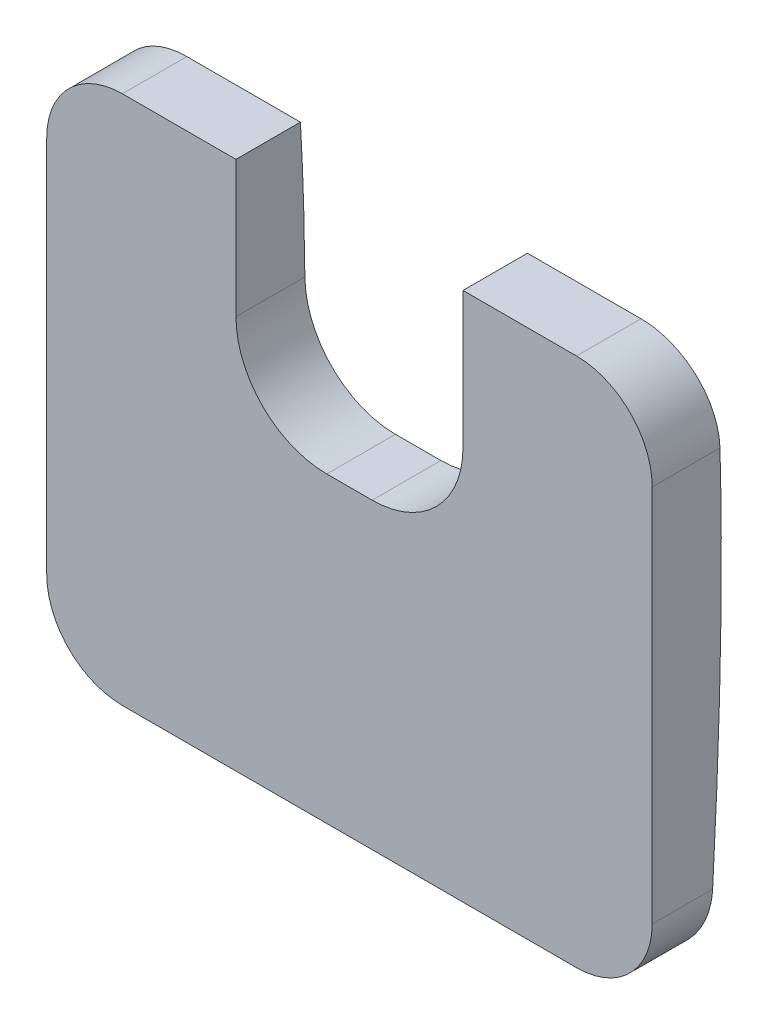
ISO-10303-21;
HEADER;
FILE_DESCRIPTION(('STEP AP214'),'2;1');
FILE_NAME('part.step','',(''),(''),'','','');
FILE_SCHEMA(('AUTOMOTIVE_DESIGN { 1 0 10303 214 1 1 1 1 }'));
ENDSEC;
DATA;
#1=APPLICATION_CONTEXT('core data for automotive mechanical design processes');
#2=APPLICATION_PROTOCOL_DEFINITION('international standard','automotive_design',2000,#1);
#3=PRODUCT_CONTEXT('',#1,'mechanical');
#4=PRODUCT('Part','Part','',(#3));
#5=PRODUCT_RELATED_PRODUCT_CATEGORY('part','',(#4));
#6=PRODUCT_DEFINITION_FORMATION('','',#4);
#7=PRODUCT_DEFINITION_CONTEXT('part definition',#1,'design');
#8=PRODUCT_DEFINITION('design','',#6,#7);
#9=PRODUCT_DEFINITION_SHAPE('','',#8);
#10=(LENGTH_UNIT() NAMED_UNIT(*) SI_UNIT(.MILLI.,.METRE.));
#11=(NAMED_UNIT(*) PLANE_ANGLE_UNIT() SI_UNIT($,.RADIAN.));
#12=(NAMED_UNIT(*) SI_UNIT($,.STERADIAN.) SOLID_ANGLE_UNIT());
#13=UNCERTAINTY_MEASURE_WITH_UNIT(LENGTH_MEASURE(1.E-05),#10,'distance_accuracy_value','');
#14=(GEOMETRIC_REPRESENTATION_CONTEXT(3) GLOBAL_UNCERTAINTY_ASSIGNED_CONTEXT((#13)) GLOBAL_UNIT_ASSIGNED_CONTEXT((#10,
#11,#12)) REPRESENTATION_CONTEXT('',''));
#15=CARTESIAN_POINT('',(0.,0.,0.));
#16=DIRECTION('',(0.,0.,1.));
#17=DIRECTION('',(1.,0.,0.));
#18=AXIS2_PLACEMENT_3D('',#15,#16,#17);
#19=CARTESIAN_POINT('',(291.807940561402,15.696584156694,-5.));
#20=DIRECTION('',(0.,1.,0.));
#21=DIRECTION('',(0.,0.,1.));
#22=AXIS2_PLACEMENT_3D('',#19,#20,#21);
#23=PLANE('',#22);
#24=DIRECTION('',(0.,0.,1.));
#25=VECTOR('',#24,1.);
#26=CARTESIAN_POINT('',(321.807940561402,15.696584156694,-5.));
#27=LINE('',#26,#25);
#28=CARTESIAN_POINT('',(321.807940561402,15.6965841566951,-4.25834069246929));
#29=VERTEX_POINT('',#28);
#30=CARTESIAN_POINT('',(321.807940561402,15.696584156694,0.));
#31=VERTEX_POINT('',#30);
#32=EDGE_CURVE('E187',#29,#31,#27,.T.);
#33=ORIENTED_EDGE('',*,*,#32,.F.);
#34=DIRECTION('',(1.,0.,-3.63875596320897E-13));
#35=VECTOR('',#34,1.);
#36=CARTESIAN_POINT('',(306.807940561462,15.6965841566941,-4.25834069246383));
#37=LINE('',#36,#35);
#38=CARTESIAN_POINT('',(314.307940561439,15.6965841566943,-4.25834069246658));
#39=VERTEX_POINT('',#38);
#40=EDGE_CURVE('E217',#29,#39,#37,.F.);
#41=ORIENTED_EDGE('',*,*,#40,.T.);
#42=DIRECTION('',(0.,0.,1.));
#43=VECTOR('',#42,1.);
#44=CARTESIAN_POINT('',(314.307940561431,15.696584156694,-26.2132034355964));
#45=LINE('',#44,#43);
#46=CARTESIAN_POINT('',(314.307940561431,15.696584156694,0.));
#47=VERTEX_POINT('',#46);
#48=EDGE_CURVE('E153',#39,#47,#45,.T.);
#49=ORIENTED_EDGE('',*,*,#48,.T.);
#50=DIRECTION('',(-1.,0.,0.));
#51=VECTOR('',#50,1.);
#52=CARTESIAN_POINT('',(291.807940561402,15.696584156694,0.));
#53=LINE('',#52,#51);
#54=EDGE_CURVE('E182',#31,#47,#53,.T.);
#55=ORIENTED_EDGE('',*,*,#54,.F.);
#56=EDGE_LOOP('',(#33,#41,#49,#55));
#57=FACE_BOUND('',#56,.T.);
#58=ADVANCED_FACE('F33',(#57),#23,.T.);
#59=DIRECTION('',(0.,0.,1.));
#60=VECTOR('',#59,1.);
#61=CARTESIAN_POINT('',(299.307940561431,15.696584156694,-26.2132034355964));
#62=LINE('',#61,#60);
#63=CARTESIAN_POINT('',(299.307940561431,15.696584156694,-4.25834069246106));
#64=VERTEX_POINT('',#63);
#65=CARTESIAN_POINT('',(299.307940561431,15.696584156694,0.));
#66=VERTEX_POINT('',#65);
#67=EDGE_CURVE('E57',#64,#66,#62,.T.);
#68=ORIENTED_EDGE('',*,*,#67,.F.);
#69=DIRECTION('',(1.,0.,-3.63875596320897E-13));
#70=VECTOR('',#69,1.);
#71=CARTESIAN_POINT('',(306.807940561462,15.6965841566941,-4.25834069246383));
#72=LINE('',#71,#70);
#73=CARTESIAN_POINT('',(291.807940561402,15.6965841566931,-4.25834069245837));
#74=VERTEX_POINT('',#73);
#75=EDGE_CURVE('E50',#64,#74,#72,.F.);
#76=ORIENTED_EDGE('',*,*,#75,.T.);
#77=DIRECTION('',(0.,0.,1.));
#78=VECTOR('',#77,1.);
#79=CARTESIAN_POINT('',(291.807940561402,15.696584156694,-5.));
#80=LINE('',#79,#78);
#81=CARTESIAN_POINT('',(291.807940561402,15.696584156694,0.));
#82=VERTEX_POINT('',#81);
#83=EDGE_CURVE('E44',#74,#82,#80,.T.);
#84=ORIENTED_EDGE('',*,*,#83,.T.);
#85=EDGE_CURVE('E181',#66,#82,#53,.T.);
#86=ORIENTED_EDGE('',*,*,#85,.F.);
#87=EDGE_LOOP('',(#68,#76,#84,#86));
#88=FACE_BOUND('',#87,.T.);
#89=ADVANCED_FACE('F216',(#88),#23,.T.);
#90=CARTESIAN_POINT('',(321.807940561265,10.6965841566941,-5.));
#91=DIRECTION('',(0.,0.,1.));
#92=DIRECTION('',(1.,0.,0.));
#93=AXIS2_PLACEMENT_3D('',#90,#91,#92);
#94=CYLINDRICAL_SURFACE('',#93,4.99999999999995);
#95=DIRECTION('',(0.,0.,1.));
#96=VECTOR('',#95,1.);
#97=CARTESIAN_POINT('',(326.807940561397,10.6965841565873,-5.));
#98=LINE('',#97,#96);
#99=CARTESIAN_POINT('',(326.807940561397,10.6965841565873,-4.47610932860178));
#100=VERTEX_POINT('',#99);
#101=CARTESIAN_POINT('',(326.807940561397,10.6965841565873,0.));
#102=VERTEX_POINT('',#101);
#103=EDGE_CURVE('E189',#100,#102,#98,.T.);
#104=ORIENTED_EDGE('',*,*,#103,.F.);
#105=CARTESIAN_POINT('',(326.807940561265,10.6965841565873,-4.47610932860179));
#106=CARTESIAN_POINT('',(326.807955681955,10.8373025921257,-4.47200247518613));
#107=CARTESIAN_POINT('',(326.802000697937,10.9780139935325,-4.46773641662479));
#108=CARTESIAN_POINT('',(326.778262179565,11.2584195482503,-4.4589198899167));
#109=CARTESIAN_POINT('',(326.760479256061,11.3981137537176,-4.45436943646846));
#110=CARTESIAN_POINT('',(326.713214758485,11.6753893420703,-4.44502130149415));
#111=CARTESIAN_POINT('',(326.683742231802,11.8129722736781,-4.44022381365795));
#112=CARTESIAN_POINT('',(326.613314757692,12.085157882331,-4.43042339593424));
#113=CARTESIAN_POINT('',(326.572359938321,12.2197605925952,-4.42542046833843));
#114=CARTESIAN_POINT('',(326.479245446464,12.485070090166,-4.41526044287359));
#115=CARTESIAN_POINT('',(326.427082587139,12.6157757573454,-4.41010330151596));
#116=CARTESIAN_POINT('',(326.311909297627,12.8723711912107,-4.39969504037403));
#117=CARTESIAN_POINT('',(326.248894878895,12.9982591662617,-4.39444388667318));
#118=CARTESIAN_POINT('',(326.112515337006,13.2442102186557,-4.38391976882029));
#119=CARTESIAN_POINT('',(326.039155655271,13.3642763138712,-4.3786468175397));
#120=CARTESIAN_POINT('',(325.88255354035,13.5978434288808,-4.36814751137418));
#121=CARTESIAN_POINT('',(325.799307680356,13.7113421518598,-4.36292117332545));
#122=CARTESIAN_POINT('',(325.623529279272,13.9309413435465,-4.35259313122389));
#123=CARTESIAN_POINT('',(325.530995229563,14.0370406056509,-4.34749144758571));
#124=CARTESIAN_POINT('',(325.337307558281,14.2410663413398,-4.33749297384899));
#125=CARTESIAN_POINT('',(325.236153940331,14.3389928183599,-4.33259618366433));
#126=CARTESIAN_POINT('',(325.025905162658,14.5260104941886,-4.32308493897687));
#127=CARTESIAN_POINT('',(324.916807089316,14.6150984228844,-4.31847058921231));
#128=CARTESIAN_POINT('',(324.691516043764,14.7837328082437,-4.3096055480908));
#129=CARTESIAN_POINT('',(324.575325557532,14.8632825794963,-4.30535473055148));
#130=CARTESIAN_POINT('',(324.336631710137,15.0123133029844,-4.29728900304789));
#131=CARTESIAN_POINT('',(324.214127931951,15.0817935889249,-4.29347412193294));
#132=CARTESIAN_POINT('',(323.963732991553,15.2101578040201,-4.2863506664779));
#133=CARTESIAN_POINT('',(323.835843814635,15.2690455965548,-4.28304190760694));
#134=CARTESIAN_POINT('',(323.575578605425,15.3758180351717,-4.27699107311555));
#135=CARTESIAN_POINT('',(323.443203938469,15.4237059955723,-4.27424882682644));
#136=CARTESIAN_POINT('',(323.174931220594,15.5081451773676,-4.26938204659243));
#137=CARTESIAN_POINT('',(323.039034036675,15.5446991602314,-4.26725736218945));
#138=CARTESIAN_POINT('',(322.722347553336,15.6156939850449,-4.26311303103576));
#139=CARTESIAN_POINT('',(322.540607590983,15.6460262548773,-4.26132672180894));
#140=CARTESIAN_POINT('',(322.266542287529,15.6763571769092,-4.25953711124066));
#141=CARTESIAN_POINT('',(322.174990489759,15.6839395636655,-4.25908888534154));
#142=CARTESIAN_POINT('',(321.991613445475,15.6940524529484,-4.25849061029251));
#143=CARTESIAN_POINT('',(321.899788217687,15.6965832937884,-4.2583405411744));
#144=CARTESIAN_POINT('',(321.807940561402,15.696584156694,-4.25834069246935));
#145=B_SPLINE_CURVE_WITH_KNOTS('',3,(#105,#106,#107,#108,#109,#110,#111,#112,#113,#114,#115,
#116,#117,#118,#119,#120,#121,#122,#123,#124,#125,#126,#127,#128,#129,#130,#131,#132,#133,#134,
#135,#136,#137,#138,#139,#140,#141,#142,#143,#144),.UNSPECIFIED.,.F.,.F.,(4,2,2,2,2,2,2,2,2,2,2,
2,2,2,2,2,2,2,2,4),(0.,0.422205697908129,0.844389592788697,1.26624736611067,1.68810043482523,
2.11007361019863,2.53220221626082,2.95410961269885,3.3761636824142,3.79828641481032,
4.22040896975973,4.64268712497839,5.06481810708548,5.48697700874424,5.90898162359839,
6.33085891853793,6.7526333441844,7.30414410862671,7.57962579073973,7.85508902261871),.UNSPECIFIED.);
#146=EDGE_CURVE('E282',#100,#29,#145,.T.);
#147=ORIENTED_EDGE('',*,*,#146,.T.);
#148=ORIENTED_EDGE('',*,*,#32,.T.);
#149=CARTESIAN_POINT('',(321.807940561265,10.6965841566941,0.));
#150=DIRECTION('',(0.,0.,1.));
#151=DIRECTION('',(1.,0.,0.));
#152=AXIS2_PLACEMENT_3D('',#149,#150,#151);
#153=CIRCLE('',#152,4.99999999999995);
#154=EDGE_CURVE('E178',#102,#31,#153,.T.);
#155=ORIENTED_EDGE('',*,*,#154,.F.);
#156=EDGE_LOOP('',(#104,#147,#148,#155));
#157=FACE_BOUND('',#156,.T.);
#158=ADVANCED_FACE('F275',(#157),#94,.T.);
#159=CARTESIAN_POINT('',(326.807940561397,10.6965841565873,-5.));
#160=DIRECTION('',(1.,0.,0.));
#161=DIRECTION('',(0.,0.,-1.));
#162=AXIS2_PLACEMENT_3D('',#159,#160,#161);
#163=PLANE('',#162);
#164=DIRECTION('',(0.,0.,1.));
#165=VECTOR('',#164,1.);
#166=CARTESIAN_POINT('',(326.807940561397,-14.3034158434079,-5.));
#167=LINE('',#166,#165);
#168=CARTESIAN_POINT('',(326.807940561397,-14.3034158434079,-3.99279363601595));
#169=VERTEX_POINT('',#168);
#170=CARTESIAN_POINT('',(326.807940561397,-14.3034158434079,0.));
#171=VERTEX_POINT('',#170);
#172=EDGE_CURVE('E191',#169,#171,#167,.T.);
#173=ORIENTED_EDGE('',*,*,#172,.F.);
#174=CARTESIAN_POINT('',(326.807940561401,-36.0189411442895,-2.36233348947626));
#175=CARTESIAN_POINT('',(326.807940561401,-33.8174655472411,-2.5640594077421));
#176=CARTESIAN_POINT('',(326.8079405614,-28.3807282534533,-3.03835451507526));
#177=CARTESIAN_POINT('',(326.807940561399,-19.7070258289108,-3.6921119697029));
#178=CARTESIAN_POINT('',(326.807940561398,-9.99924832097791,-4.24869143122706));
#179=CARTESIAN_POINT('',(326.807940561398,-0.295866356779825,-4.57603342067714));
#180=CARTESIAN_POINT('',(326.807940561397,7.77491004750242,-4.58425567657189));
#181=CARTESIAN_POINT('',(326.807940561397,14.2071720681441,-4.36336944783123));
#182=CARTESIAN_POINT('',(326.807940561397,19.0074377170733,-4.05350743605976));
#183=CARTESIAN_POINT('',(326.807940561396,22.975407380882,-3.64274931501332));
#184=CARTESIAN_POINT('',(326.807940561396,26.1109681812323,-3.1878234741688));
#185=CARTESIAN_POINT('',(326.807940561396,28.4294029067618,-2.76888768837752));
#186=CARTESIAN_POINT('',(326.807940561396,30.7004759910017,-2.25200999653488));
#187=CARTESIAN_POINT('',(326.807940561396,32.5183143699654,-1.71445781541652));
#188=CARTESIAN_POINT('',(326.807940561396,33.7637393630606,-1.23759557341227));
#189=CARTESIAN_POINT('',(326.807940561397,34.291166311014,-0.996644738967104));
#190=CARTESIAN_POINT('',(326.807940561397,34.4946850505463,-0.895432675926265));
#191=B_SPLINE_CURVE_WITH_KNOTS('',3,(#174,#175,#176,#177,#178,#179,#180,#181,#182,#183,#184,
#185,#186,#187,#188,#189,#190),.UNSPECIFIED.,.F.,.F.,(4,1,1,1,1,1,1,1,1,1,1,1,1,1,4),
(0.514345279864183,0.543338481354267,0.585917218611175,0.628495955868082,0.67107469312499,
0.713653430381897,0.734942799010351,0.756232167638805,0.777521536267259,0.788166220581485,
0.798810904895712,0.809455589209939,0.820100273524166,0.82542261568128,0.829038536987228),.UNSPECIFIED.);
#192=EDGE_CURVE('E291',#169,#100,#191,.T.);
#193=ORIENTED_EDGE('',*,*,#192,.T.);
#194=ORIENTED_EDGE('',*,*,#103,.T.);
#195=DIRECTION('',(0.,1.,0.));
#196=VECTOR('',#195,1.);
#197=CARTESIAN_POINT('',(326.807940561397,10.6965841565873,0.));
#198=LINE('',#197,#196);
#199=EDGE_CURVE('E175',#171,#102,#198,.T.);
#200=ORIENTED_EDGE('',*,*,#199,.F.);
#201=EDGE_LOOP('',(#173,#193,#194,#200));
#202=FACE_BOUND('',#201,.T.);
#203=ADVANCED_FACE('F279',(#202),#163,.T.);
#204=CARTESIAN_POINT('',(321.80794056143,-14.3034158434079,-5.));
#205=DIRECTION('',(0.,0.,1.));
#206=DIRECTION('',(1.,0.,0.));
#207=AXIS2_PLACEMENT_3D('',#204,#205,#206);
#208=CYLINDRICAL_SURFACE('',#207,4.99999999996626);
#209=DIRECTION('',(0.,0.,1.));
#210=VECTOR('',#209,1.);
#211=CARTESIAN_POINT('',(321.807940561431,-19.3034158433742,-5.));
#212=LINE('',#211,#210);
#213=CARTESIAN_POINT('',(321.807940561431,-19.3034158433731,-3.68955676077569));
#214=VERTEX_POINT('',#213);
#215=CARTESIAN_POINT('',(321.807940561431,-19.3034158433742,0.));
#216=VERTEX_POINT('',#215);
#217=EDGE_CURVE('E193',#214,#216,#212,.T.);
#218=ORIENTED_EDGE('',*,*,#217,.F.);
#219=CARTESIAN_POINT('',(321.807940561431,-19.3034158433742,-3.68955676077562));
#220=CARTESIAN_POINT('',(321.94836098713,-19.3034311239914,-3.68955533920949));
#221=CARTESIAN_POINT('',(322.088779115145,-19.2975011181623,-3.6899447399878));
#222=CARTESIAN_POINT('',(322.368608829737,-19.273860977636,-3.69149491474282));
#223=CARTESIAN_POINT('',(322.508020469063,-19.2561514648945,-3.6926556479933));
#224=CARTESIAN_POINT('',(322.784736612698,-19.2090820707162,-3.69573695230666));
#225=CARTESIAN_POINT('',(322.922042753621,-19.1797317700553,-3.69765689850685));
#226=CARTESIAN_POINT('',(323.193688564898,-19.1095969602916,-3.70223659090465));
#227=CARTESIAN_POINT('',(323.328028268651,-19.0688125799905,-3.70489632876872));
#228=CARTESIAN_POINT('',(323.5928262627,-18.9760883357394,-3.71092957633759));
#229=CARTESIAN_POINT('',(323.723283466714,-18.9241453825308,-3.71430328370148));
#230=CARTESIAN_POINT('',(323.979400267755,-18.8094625377062,-3.72173133795077));
#231=CARTESIAN_POINT('',(324.105058073767,-18.7467186626385,-3.72578593593962));
#232=CARTESIAN_POINT('',(324.350570398726,-18.6109327341103,-3.73453200044621));
#233=CARTESIAN_POINT('',(324.470427944529,-18.5378961314698,-3.73922312982127));
#234=CARTESIAN_POINT('',(324.703607409246,-18.3819928477441,-3.7491992799403));
#235=CARTESIAN_POINT('',(324.81692690136,-18.2991225510264,-3.75448451908745));
#236=CARTESIAN_POINT('',(325.03625415778,-18.1241078917265,-3.76559932814451));
#237=CARTESIAN_POINT('',(325.142257141034,-18.0319575599136,-3.77142924823507));
#238=CARTESIAN_POINT('',(325.346161583107,-17.8390483346421,-3.78357639899047));
#239=CARTESIAN_POINT('',(325.444060011119,-17.738286249074,-3.78989381026815));
#240=CARTESIAN_POINT('',(325.631006559448,-17.5289172333644,-3.80295278340061));
#241=CARTESIAN_POINT('',(325.720056130414,-17.4203115941243,-3.80969427543622));
#242=CARTESIAN_POINT('',(325.888727351489,-17.1959719712,-3.82354173596361));
#243=CARTESIAN_POINT('',(325.968345630918,-17.0802354613207,-3.83064783347035));
#244=CARTESIAN_POINT('',(326.117705749165,-16.8422538411673,-3.84517148887448));
#245=CARTESIAN_POINT('',(326.187427751512,-16.7199963160121,-3.8525896347424));
#246=CARTESIAN_POINT('',(326.316316769331,-16.4700530415555,-3.86765736320167));
#247=CARTESIAN_POINT('',(326.375483721156,-16.3423672595277,-3.87530694718825));
#248=CARTESIAN_POINT('',(326.482820831575,-16.0825279613778,-3.89076715964966));
#249=CARTESIAN_POINT('',(326.530996086842,-15.9503765486668,-3.89857771164687));
#250=CARTESIAN_POINT('',(326.616034441386,-15.6825402338636,-3.9142936605079));
#251=CARTESIAN_POINT('',(326.65289995549,-15.5468560927921,-3.92219903674999));
#252=CARTESIAN_POINT('',(326.725157218754,-15.2283788872064,-3.94061440387321));
#253=CARTESIAN_POINT('',(326.756198733006,-15.0445705214651,-3.95113814295161));
#254=CARTESIAN_POINT('',(326.787239468751,-14.767351015527,-3.96684363805454));
#255=CARTESIAN_POINT('',(326.794999450839,-14.6747396394934,-3.97206288318052));
#256=CARTESIAN_POINT('',(326.805349342046,-14.4892323760307,-3.98246161193553));
#257=CARTESIAN_POINT('',(326.807939594775,-14.3963365079216,-3.98764109818437));
#258=CARTESIAN_POINT('',(326.807940561397,-14.3034158434079,-3.99279363601595));
#259=B_SPLINE_CURVE_WITH_KNOTS('',3,(#219,#220,#221,#222,#223,#224,#225,#226,#227,#228,#229,
#230,#231,#232,#233,#234,#235,#236,#237,#238,#239,#240,#241,#242,#243,#244,#245,#246,#247,#248,
#249,#250,#251,#252,#253,#254,#255,#256,#257,#258),.UNSPECIFIED.,.F.,.F.,(4,2,2,2,2,2,2,2,2,2,2,
2,2,2,2,2,2,2,2,4),(0.,0.421132316312632,0.842242398679262,1.26300660954154,1.68376608079933,
2.10464219007426,2.52567385512012,2.94648338241516,3.36744811431801,3.78868537574154,
4.21007945959485,4.63140434726126,5.05287936215348,5.4751876148785,5.89749841401181,
6.31961299460281,6.74163738353355,7.3004432741648,7.57956959893323,7.85867737077976),.UNSPECIFIED.);
#260=EDGE_CURVE('E324',#214,#169,#259,.T.);
#261=ORIENTED_EDGE('',*,*,#260,.T.);
#262=ORIENTED_EDGE('',*,*,#172,.T.);
#263=CARTESIAN_POINT('',(321.80794056143,-14.3034158434079,0.));
#264=DIRECTION('',(0.,0.,1.));
#265=DIRECTION('',(1.,0.,0.));
#266=AXIS2_PLACEMENT_3D('',#263,#264,#265);
#267=CIRCLE('',#266,4.99999999996626);
#268=EDGE_CURVE('E172',#216,#171,#267,.T.);
#269=ORIENTED_EDGE('',*,*,#268,.F.);
#270=EDGE_LOOP('',(#218,#261,#262,#269));
#271=FACE_BOUND('',#270,.T.);
#272=ADVANCED_FACE('F335',(#271),#208,.T.);
#273=CARTESIAN_POINT('',(291.807940561431,-19.3034158433742,-5.));
#274=DIRECTION('',(0.,-1.,0.));
#275=DIRECTION('',(0.,0.,-1.));
#276=AXIS2_PLACEMENT_3D('',#273,#274,#275);
#277=PLANE('',#276);
#278=DIRECTION('',(0.,0.,1.));
#279=VECTOR('',#278,1.);
#280=CARTESIAN_POINT('',(291.807940561431,-19.3034158433742,-5.));
#281=LINE('',#280,#279);
#282=CARTESIAN_POINT('',(291.807940561431,-19.3034158433742,-3.68955676076484));
#283=VERTEX_POINT('',#282);
#284=CARTESIAN_POINT('',(291.807940561431,-19.3034158433742,0.));
#285=VERTEX_POINT('',#284);
#286=EDGE_CURVE('E195',#283,#285,#281,.T.);
#287=ORIENTED_EDGE('',*,*,#286,.F.);
#288=DIRECTION('',(1.,0.,-3.63875596320897E-13));
#289=VECTOR('',#288,1.);
#290=CARTESIAN_POINT('',(306.807940561464,-19.3034158433742,-3.68955676077023));
#291=LINE('',#290,#289);
#292=EDGE_CURVE('E325',#283,#214,#291,.T.);
#293=ORIENTED_EDGE('',*,*,#292,.T.);
#294=ORIENTED_EDGE('',*,*,#217,.T.);
#295=DIRECTION('',(1.,0.,0.));
#296=VECTOR('',#295,1.);
#297=CARTESIAN_POINT('',(291.807940561431,-19.3034158433742,0.));
#298=LINE('',#297,#296);
#299=EDGE_CURVE('E169',#285,#216,#298,.T.);
#300=ORIENTED_EDGE('',*,*,#299,.F.);
#301=EDGE_LOOP('',(#287,#293,#294,#300));
#302=FACE_BOUND('',#301,.T.);
#303=ADVANCED_FACE('F339',(#302),#277,.T.);
#304=CARTESIAN_POINT('',(291.80794056143,-14.3034158433337,-5.));
#305=DIRECTION('',(0.,0.,1.));
#306=DIRECTION('',(1.,0.,0.));
#307=AXIS2_PLACEMENT_3D('',#304,#305,#306);
#308=CYLINDRICAL_SURFACE('',#307,5.00000000004052);
#309=DIRECTION('',(0.,0.,1.));
#310=VECTOR('',#309,1.);
#311=CARTESIAN_POINT('',(286.80794056139,-14.3034158433629,-5.));
#312=LINE('',#311,#310);
#313=CARTESIAN_POINT('',(286.80794056139,-14.303415833687,-3.99279363654058));
#314=VERTEX_POINT('',#313);
#315=CARTESIAN_POINT('',(286.80794056139,-14.3034158433629,0.));
#316=VERTEX_POINT('',#315);
#317=EDGE_CURVE('E197',#314,#316,#312,.T.);
#318=ORIENTED_EDGE('',*,*,#317,.F.);
#319=CARTESIAN_POINT('',(286.80794056139,-14.3034158433629,-3.99279363600404));
#320=CARTESIAN_POINT('',(286.807925562334,-14.4442523615923,-3.98498466726833));
#321=CARTESIAN_POINT('',(286.813890406568,-14.585082971853,-3.97711001647148));
#322=CARTESIAN_POINT('',(286.837669575156,-14.8657298767975,-3.96129106787373));
#323=CARTESIAN_POINT('',(286.855483336385,-15.0055462193656,-3.95334677340039));
#324=CARTESIAN_POINT('',(286.902833059134,-15.2830754787565,-3.93745523740906));
#325=CARTESIAN_POINT('',(286.932360551218,-15.4207898408381,-3.92950800215605));
#326=CARTESIAN_POINT('',(287.002923478264,-15.6932394681444,-3.91366945234413));
#327=CARTESIAN_POINT('',(287.043958774994,-15.8279747691329,-3.90577813711468));
#328=CARTESIAN_POINT('',(287.137262934718,-16.0935517393583,-3.8901149815633));
#329=CARTESIAN_POINT('',(287.189535234996,-16.2243922032311,-3.88234317858014));
#330=CARTESIAN_POINT('',(287.304957602125,-16.4812534271177,-3.86698586731402));
#331=CARTESIAN_POINT('',(287.368111668704,-16.607272394043,-3.85940042870711));
#332=CARTESIAN_POINT('',(287.504800973935,-16.8534754601292,-3.84449027049305));
#333=CARTESIAN_POINT('',(287.578330593902,-16.9736626703374,-3.83716541244399));
#334=CARTESIAN_POINT('',(287.735304510557,-17.20745920019,-3.82283627670485));
#335=CARTESIAN_POINT('',(287.818752240965,-17.3210662213621,-3.81583211121013));
#336=CARTESIAN_POINT('',(287.994895692875,-17.5407760387314,-3.80221658227124));
#337=CARTESIAN_POINT('',(288.087585532953,-17.6468835348678,-3.79560497323575));
#338=CARTESIAN_POINT('',(288.281601141313,-17.8509146711143,-3.78283243097442));
#339=CARTESIAN_POINT('',(288.382926896283,-17.94883832384,-3.77667149705385));
#340=CARTESIAN_POINT('',(288.593535178636,-18.1358349437969,-3.76485752195503));
#341=CARTESIAN_POINT('',(288.70282062569,-18.2249046347143,-3.75920466886024));
#342=CARTESIAN_POINT('',(288.928499089285,-18.3934827535134,-3.74846666701309));
#343=CARTESIAN_POINT('',(289.044889604807,-18.4729945169015,-3.74338132025814));
#344=CARTESIAN_POINT('',(289.283852986101,-18.6218384757771,-3.73383176821649));
#345=CARTESIAN_POINT('',(289.406418880877,-18.6911818185368,-3.72936688302561));
#346=CARTESIAN_POINT('',(289.656931832521,-18.8192708660216,-3.72109781600739));
#347=CARTESIAN_POINT('',(289.784876899454,-18.8780204479234,-3.71729339247888));
#348=CARTESIAN_POINT('',(290.045245523601,-18.984513863245,-3.71038269270915));
#349=CARTESIAN_POINT('',(290.177667684246,-19.0322610930313,-3.70727620102757));
#350=CARTESIAN_POINT('',(290.4460267243,-19.1164162569944,-3.70179221242807));
#351=CARTESIAN_POINT('',(290.581962731077,-19.1528269777446,-3.69941453636568));
#352=CARTESIAN_POINT('',(290.897865239436,-19.2232961508283,-3.6948079209061));
#353=CARTESIAN_POINT('',(291.07875668208,-19.2533398309533,-3.69283968483182));
#354=CARTESIAN_POINT('',(291.35152765847,-19.2833818190595,-3.6908706481328));
#355=CARTESIAN_POINT('',(291.442643902325,-19.2908918862931,-3.69037818970625));
#356=CARTESIAN_POINT('',(291.625146270998,-19.3009083187792,-3.68972125682674));
#357=CARTESIAN_POINT('',(291.71653237787,-19.3034150095671,-3.6895567610355));
#358=CARTESIAN_POINT('',(291.807940561431,-19.3034158433742,-3.68955676076484));
#359=B_SPLINE_CURVE_WITH_KNOTS('',3,(#319,#320,#321,#322,#323,#324,#325,#326,#327,#328,#329,
#330,#331,#332,#333,#334,#335,#336,#337,#338,#339,#340,#341,#342,#343,#344,#345,#346,#347,#348,
#349,#350,#351,#352,#353,#354,#355,#356,#357,#358),.UNSPECIFIED.,.F.,.F.,(4,2,2,2,2,2,2,2,2,2,2,
2,2,2,2,2,2,2,2,4),(0.,0.423029269431222,0.846038435633772,1.26874230722951,1.69144110150882,
2.11426937949426,2.53725340610167,2.96000924653474,3.38291187671018,3.80554708037446,
4.228181632524,4.65097199839562,5.07361438872738,5.49578993093506,5.91781064747426,
6.33970091345987,6.76148739457934,7.3103686804158,7.58453250565308,7.85867849235627),.UNSPECIFIED.);
#360=EDGE_CURVE('E329',#314,#283,#359,.T.);
#361=ORIENTED_EDGE('',*,*,#360,.T.);
#362=ORIENTED_EDGE('',*,*,#286,.T.);
#363=CARTESIAN_POINT('',(291.80794056143,-14.3034158433337,0.));
#364=DIRECTION('',(0.,0.,1.));
#365=DIRECTION('',(1.,0.,0.));
#366=AXIS2_PLACEMENT_3D('',#363,#364,#365);
#367=CIRCLE('',#366,5.00000000004052);
#368=EDGE_CURVE('E166',#316,#285,#367,.T.);
#369=ORIENTED_EDGE('',*,*,#368,.F.);
#370=EDGE_LOOP('',(#318,#361,#362,#369));
#371=FACE_BOUND('',#370,.T.);
#372=ADVANCED_FACE('F342',(#371),#308,.T.);
#373=CARTESIAN_POINT('',(286.80794056139,-14.3034158433629,-5.));
#374=DIRECTION('',(-1.,0.,0.));
#375=DIRECTION('',(0.,-1.,0.));
#376=AXIS2_PLACEMENT_3D('',#373,#374,#375);
#377=PLANE('',#376);
#378=DIRECTION('',(0.,0.,1.));
#379=VECTOR('',#378,1.);
#380=CARTESIAN_POINT('',(286.80794056139,10.6965841566615,-5.));
#381=LINE('',#380,#379);
#382=CARTESIAN_POINT('',(286.80794056139,10.6965841566615,-4.47610932858498));
#383=VERTEX_POINT('',#382);
#384=CARTESIAN_POINT('',(286.80794056139,10.6965841566615,0.));
#385=VERTEX_POINT('',#384);
#386=EDGE_CURVE('E185',#383,#385,#381,.T.);
#387=ORIENTED_EDGE('',*,*,#386,.F.);
#388=CARTESIAN_POINT('',(286.807940561392,-36.0189411442922,-2.36233348946171));
#389=CARTESIAN_POINT('',(286.807940561392,-33.8174655472438,-2.56405940772755));
#390=CARTESIAN_POINT('',(286.807940561392,-28.380728253456,-3.0383545150607));
#391=CARTESIAN_POINT('',(286.807940561391,-19.7070258289135,-3.69211196968835));
#392=CARTESIAN_POINT('',(286.80794056139,-9.9992483209806,-4.2486914312125));
#393=CARTESIAN_POINT('',(286.807940561389,-0.295866356782511,-4.57603342066259));
#394=CARTESIAN_POINT('',(286.807940561389,7.77491004749974,-4.58425567655734));
#395=CARTESIAN_POINT('',(286.807940561388,14.2071720681414,-4.36336944781667));
#396=CARTESIAN_POINT('',(286.807940561388,19.0074377170706,-4.0535074360452));
#397=CARTESIAN_POINT('',(286.807940561388,22.9754073808794,-3.64274931499877));
#398=CARTESIAN_POINT('',(286.807940561388,26.1109681812296,-3.18782347415424));
#399=CARTESIAN_POINT('',(286.807940561388,28.4294029067591,-2.76888768836297));
#400=CARTESIAN_POINT('',(286.807940561388,30.700475990999,-2.25200999652033));
#401=CARTESIAN_POINT('',(286.807940561388,32.5183143699627,-1.71445781540196));
#402=CARTESIAN_POINT('',(286.807940561388,33.7637393630579,-1.23759557339772));
#403=CARTESIAN_POINT('',(286.807940561388,34.2911663110113,-0.996644738952549));
#404=CARTESIAN_POINT('',(286.807940561388,34.4946850505437,-0.895432675911709));
#405=B_SPLINE_CURVE_WITH_KNOTS('',3,(#388,#389,#390,#391,#392,#393,#394,#395,#396,#397,#398,
#399,#400,#401,#402,#403,#404),.UNSPECIFIED.,.F.,.F.,(4,1,1,1,1,1,1,1,1,1,1,1,1,1,4),
(0.514345279864183,0.543338481354267,0.585917218611175,0.628495955868082,0.67107469312499,
0.713653430381897,0.734942799010351,0.756232167638805,0.777521536267259,0.788166220581485,
0.798810904895712,0.809455589209939,0.820100273524166,0.82542261568128,0.829038536987228),.UNSPECIFIED.);
#406=EDGE_CURVE('E234',#383,#314,#405,.F.);
#407=ORIENTED_EDGE('',*,*,#406,.T.);
#408=ORIENTED_EDGE('',*,*,#317,.T.);
#409=DIRECTION('',(0.,-1.,0.));
#410=VECTOR('',#409,1.);
#411=CARTESIAN_POINT('',(286.80794056139,-14.3034158433629,0.));
#412=LINE('',#411,#410);
#413=EDGE_CURVE('E162',#385,#316,#412,.T.);
#414=ORIENTED_EDGE('',*,*,#413,.F.);
#415=EDGE_LOOP('',(#387,#407,#408,#414));
#416=FACE_BOUND('',#415,.T.);
#417=ADVANCED_FACE('F207',(#416),#377,.T.);
#418=CARTESIAN_POINT('',(291.807940561427,10.6965841566663,-5.));
#419=DIRECTION('',(0.,0.,1.));
#420=DIRECTION('',(1.,0.,0.));
#421=AXIS2_PLACEMENT_3D('',#418,#419,#420);
#422=CYLINDRICAL_SURFACE('',#421,5.0000000000377);
#423=ORIENTED_EDGE('',*,*,#83,.F.);
#424=CARTESIAN_POINT('',(291.807940561402,15.696584156704,-4.25834069245773));
#425=CARTESIAN_POINT('',(291.667460444572,15.6965994116354,-4.25833827422507));
#426=CARTESIAN_POINT('',(291.526982641611,15.6906644002865,-4.25869112297151));
#427=CARTESIAN_POINT('',(291.247034103448,15.6670041200474,-4.26008985314373));
#428=CARTESIAN_POINT('',(291.10756331508,15.6492794782652,-4.26113569770802));
#429=CARTESIAN_POINT('',(290.830729483677,15.602169486965,-4.26390178869041));
#430=CARTESIAN_POINT('',(290.693364808185,15.5727936980069,-4.26562148215568));
#431=CARTESIAN_POINT('',(290.421603175338,15.5025971634338,-4.26970148425843));
#432=CARTESIAN_POINT('',(290.287206184966,15.4617765452198,-4.27206178576481));
#433=CARTESIAN_POINT('',(290.022295406995,15.3689684910397,-4.27737919900762));
#434=CARTESIAN_POINT('',(289.891782699458,15.3169779816051,-4.2803364749919));
#435=CARTESIAN_POINT('',(289.635556784327,15.2021876618635,-4.28679345062171));
#436=CARTESIAN_POINT('',(289.509845368768,15.1393838628577,-4.29029335037731));
#437=CARTESIAN_POINT('',(289.264228070374,15.0034643509508,-4.29776897386797));
#438=CARTESIAN_POINT('',(289.144319171027,14.9303540750702,-4.30174444655561));
#439=CARTESIAN_POINT('',(288.911040382865,14.7742882281926,-4.31010372212206));
#440=CARTESIAN_POINT('',(288.797672921872,14.6913290363017,-4.3144876750479));
#441=CARTESIAN_POINT('',(288.578259537707,14.5161236773043,-4.32359008130582));
#442=CARTESIAN_POINT('',(288.472218062716,14.4238719500801,-4.32830873439772));
#443=CARTESIAN_POINT('',(288.268242811372,14.2307422528196,-4.33800200036791));
#444=CARTESIAN_POINT('',(288.170312069627,14.1298610825404,-4.34297670792963));
#445=CARTESIAN_POINT('',(287.983309971183,13.9202351554808,-4.35310043985928));
#446=CARTESIAN_POINT('',(287.894237153793,13.8114917003323,-4.35824943529844));
#447=CARTESIAN_POINT('',(287.725531873513,13.5868569899373,-4.36864595292859));
#448=CARTESIAN_POINT('',(287.645902782037,13.4709632043331,-4.37389350953613));
#449=CARTESIAN_POINT('',(287.496587798291,13.2327279408307,-4.38441671790569));
#450=CARTESIAN_POINT('',(287.4269150002,13.1103782565412,-4.38969239737058));
#451=CARTESIAN_POINT('',(287.298130839467,12.8602399984893,-4.40019375845359));
#452=CARTESIAN_POINT('',(287.239019526468,12.7324513991661,-4.40541943983659));
#453=CARTESIAN_POINT('',(287.131804454094,12.472398753768,-4.41575324294306));
#454=CARTESIAN_POINT('',(287.0836954324,12.3401368821222,-4.42086141981216));
#455=CARTESIAN_POINT('',(286.998802749636,12.0720726201526,-4.43090304213641));
#456=CARTESIAN_POINT('',(286.962016637867,11.9362710028725,-4.43583652519691));
#457=CARTESIAN_POINT('',(286.890139730486,11.6183005182746,-4.44701825831081));
#458=CARTESIAN_POINT('',(286.859317950923,11.4351355382199,-4.45318498772245));
#459=CARTESIAN_POINT('',(286.828496226393,11.1588893919322,-4.46206800230606));
#460=CARTESIAN_POINT('',(286.820790816449,11.0666033928661,-4.46496648966706));
#461=CARTESIAN_POINT('',(286.810513610784,10.8817479638742,-4.47063549142784));
#462=CARTESIAN_POINT('',(286.80794148684,10.789178552449,-4.47340601399865));
#463=CARTESIAN_POINT('',(286.80794056139,10.6965841566615,-4.47610932858498));
#464=B_SPLINE_CURVE_WITH_KNOTS('',3,(#424,#425,#426,#427,#428,#429,#430,#431,#432,#433,#434,
#435,#436,#437,#438,#439,#440,#441,#442,#443,#444,#445,#446,#447,#448,#449,#450,#451,#452,#453,
#454,#455,#456,#457,#458,#459,#460,#461,#462,#463),.UNSPECIFIED.,.F.,.F.,(4,2,2,2,2,2,2,2,2,2,2,
2,2,2,2,2,2,2,2,4),(0.,0.421311302490336,0.842600196603901,1.26354410733069,1.68448333240043,
2.10553853031835,2.52674937694532,2.9477388461614,3.36888357169309,3.79028179991053,
4.21183698753748,4.63332254416081,5.05495812117617,5.4771432137871,5.89933029071985,
6.32131501423014,6.74320834028525,7.29943089490219,7.57726857755585,7.85508849463401),.UNSPECIFIED.);
#465=EDGE_CURVE('E204',#74,#383,#464,.T.);
#466=ORIENTED_EDGE('',*,*,#465,.T.);
#467=ORIENTED_EDGE('',*,*,#386,.T.);
#468=CARTESIAN_POINT('',(291.807940561427,10.6965841566663,0.));
#469=DIRECTION('',(0.,0.,1.));
#470=DIRECTION('',(1.,0.,0.));
#471=AXIS2_PLACEMENT_3D('',#468,#469,#470);
#472=CIRCLE('',#471,5.0000000000377);
#473=EDGE_CURVE('E159',#82,#385,#472,.T.);
#474=ORIENTED_EDGE('',*,*,#473,.F.);
#475=EDGE_LOOP('',(#423,#466,#467,#474));
#476=FACE_BOUND('',#475,.T.);
#477=ADVANCED_FACE('F35',(#476),#422,.T.);
#478=CARTESIAN_POINT('',(314.307940561431,15.696584156694,-26.2132034355964));
#479=DIRECTION('',(1.,0.,0.));
#480=DIRECTION('',(0.,0.,-1.));
#481=AXIS2_PLACEMENT_3D('',#478,#479,#480);
#482=PLANE('',#481);
#483=CARTESIAN_POINT('',(314.307940561443,-36.0189411442904,-2.36233348947171));
#484=CARTESIAN_POINT('',(314.307940561443,-33.817465547242,-2.56405940773755));
#485=CARTESIAN_POINT('',(314.307940561442,-28.3807282534542,-3.03835451507071));
#486=CARTESIAN_POINT('',(314.307940561441,-19.7070258289116,-3.69211196969835));
#487=CARTESIAN_POINT('',(314.30794056144,-9.99924832097875,-4.24869143122251));
#488=CARTESIAN_POINT('',(314.30794056144,-0.295866356780665,-4.57603342067259));
#489=CARTESIAN_POINT('',(314.307940561439,7.77491004750158,-4.58425567656735));
#490=CARTESIAN_POINT('',(314.307940561439,14.2071720681432,-4.36336944782668));
#491=CARTESIAN_POINT('',(314.307940561438,19.0074377170724,-4.05350743605521));
#492=CARTESIAN_POINT('',(314.307940561438,22.9754073808812,-3.64274931500878));
#493=CARTESIAN_POINT('',(314.307940561438,26.1109681812314,-3.18782347416425));
#494=CARTESIAN_POINT('',(314.307940561438,28.4294029067609,-2.76888768837297));
#495=CARTESIAN_POINT('',(314.307940561438,30.7004759910009,-2.25200999653034));
#496=CARTESIAN_POINT('',(314.307940561438,32.5183143699646,-1.71445781541197));
#497=CARTESIAN_POINT('',(314.307940561438,33.7637393630598,-1.23759557340773));
#498=CARTESIAN_POINT('',(314.307940561439,34.2911663110132,-0.996644738962556));
#499=CARTESIAN_POINT('',(314.307940561438,34.4946850505455,-0.895432675921716));
#500=B_SPLINE_CURVE_WITH_KNOTS('',3,(#483,#484,#485,#486,#487,#488,#489,#490,#491,#492,#493,
#494,#495,#496,#497,#498,#499),.UNSPECIFIED.,.F.,.F.,(4,1,1,1,1,1,1,1,1,1,1,1,1,1,4),
(0.514345279864183,0.543338481354267,0.585917218611175,0.628495955868082,0.67107469312499,
0.713653430381897,0.734942799010351,0.756232167638805,0.777521536267259,0.788166220581485,
0.798810904895712,0.809455589209939,0.820100273524166,0.82542261568128,0.829038536987228),.UNSPECIFIED.);
#501=CARTESIAN_POINT('',(314.307940561431,6.69658415669403,-4.55345325608141));
#502=VERTEX_POINT('',#501);
#503=EDGE_CURVE('E218',#502,#39,#500,.T.);
#504=ORIENTED_EDGE('',*,*,#503,.F.);
#505=DIRECTION('',(0.,0.,1.));
#506=VECTOR('',#505,1.);
#507=CARTESIAN_POINT('',(314.307940561431,6.69658415669404,-26.2132034355964));
#508=LINE('',#507,#506);
#509=CARTESIAN_POINT('',(314.307940561431,6.69658415669404,0.));
#510=VERTEX_POINT('',#509);
#511=EDGE_CURVE('E163',#502,#510,#508,.T.);
#512=ORIENTED_EDGE('',*,*,#511,.T.);
#513=DIRECTION('',(0.,1.,0.));
#514=VECTOR('',#513,1.);
#515=CARTESIAN_POINT('',(314.307940561431,15.696584156694,0.));
#516=LINE('',#515,#514);
#517=EDGE_CURVE('E290',#510,#47,#516,.T.);
#518=ORIENTED_EDGE('',*,*,#517,.T.);
#519=ORIENTED_EDGE('',*,*,#48,.F.);
#520=EDGE_LOOP('',(#504,#512,#518,#519));
#521=FACE_BOUND('',#520,.T.);
#522=ADVANCED_FACE('F266',(#521),#482,.F.);
#523=CARTESIAN_POINT('',(308.307940561431,6.69658415669404,-26.2132034355964));
#524=DIRECTION('',(0.,0.,1.));
#525=DIRECTION('',(1.,0.,0.));
#526=AXIS2_PLACEMENT_3D('',#523,#524,#525);
#527=CYLINDRICAL_SURFACE('',#526,6.);
#528=CARTESIAN_POINT('',(308.307940561431,0.696584156694038,-4.53873800949188));
#529=CARTESIAN_POINT('',(308.47668969359,0.696566000603366,-4.53873661596602));
#530=CARTESIAN_POINT('',(308.645436205813,0.703702461748274,-4.53883732310639));
#531=CARTESIAN_POINT('',(308.981721694945,0.732153474511467,-4.5392328833444));
#532=CARTESIAN_POINT('',(309.149260729914,0.753467339758828,-4.53952772704331));
#533=CARTESIAN_POINT('',(309.481819073112,0.810120496195372,-4.54030121269272));
#534=CARTESIAN_POINT('',(309.646840200178,0.845449111938435,-4.5407797147363));
#535=CARTESIAN_POINT('',(309.973319211074,0.929874652394632,-4.54190095873989));
#536=CARTESIAN_POINT('',(310.134777138033,0.978971410365593,-4.54254369871085));
#537=CARTESIAN_POINT('',(310.453032768466,1.09060287369794,-4.54396760601445));
#538=CARTESIAN_POINT('',(310.609829053927,1.15314162128635,-4.54474881497456));
#539=CARTESIAN_POINT('',(310.917653148946,1.29122882044253,-4.54641722325494));
#540=CARTESIAN_POINT('',(311.068678812465,1.36678205553252,-4.54730446150981));
#541=CARTESIAN_POINT('',(311.363748011896,1.53030145873687,-4.5491459643792));
#542=CARTESIAN_POINT('',(311.507795220766,1.61826099957013,-4.55010019307252));
#543=CARTESIAN_POINT('',(311.78801909222,1.80603111943797,-4.55203356047982));
#544=CARTESIAN_POINT('',(311.92419300127,1.9058458077498,-4.55301270773822));
#545=CARTESIAN_POINT('',(312.187632259862,2.11657966014671,-4.55494897457625));
#546=CARTESIAN_POINT('',(312.314898672998,2.22749749460844,-4.55590609677659));
#547=CARTESIAN_POINT('',(312.559636408598,2.45965940195551,-4.55774958701131));
#548=CARTESIAN_POINT('',(312.677107730423,2.58090347551259,-4.55863595504109));
#549=CARTESIAN_POINT('',(312.9014617484,2.83290286853917,-4.56028837229997));
#550=CARTESIAN_POINT('',(313.008340523906,2.96366167889756,-4.56105437703967));
#551=CARTESIAN_POINT('',(313.21066467356,3.23367395084755,-4.56241592195364));
#552=CARTESIAN_POINT('',(313.306114003385,3.37292444817616,-4.5630115212042));
#553=CARTESIAN_POINT('',(313.484990954786,3.65904744406437,-4.56398528928431));
#554=CARTESIAN_POINT('',(313.568412208637,3.80592392430546,-4.56436334325874));
#555=CARTESIAN_POINT('',(313.722550914761,4.10612914819421,-4.5648572317075));
#556=CARTESIAN_POINT('',(313.793272976868,4.25945552546735,-4.56497316151135));
#557=CARTESIAN_POINT('',(313.921529761246,4.57148318117513,-4.56490371715587));
#558=CARTESIAN_POINT('',(313.979068253677,4.73018290803292,-4.56471842926));
#559=CARTESIAN_POINT('',(314.080560127263,5.05180157093265,-4.56401420670367));
#560=CARTESIAN_POINT('',(314.124516775038,5.21471948221092,-4.56349535236315));
#561=CARTESIAN_POINT('',(314.210167421409,5.59534554650608,-4.56187845747291));
#562=CARTESIAN_POINT('',(314.246831492145,5.81421782000588,-4.56064983256623));
#563=CARTESIAN_POINT('',(314.283492883086,6.14428125921884,-4.55831808520057));
#564=CARTESIAN_POINT('',(314.29265755304,6.25453924349029,-4.55745991977792));
#565=CARTESIAN_POINT('',(314.304880638409,6.47538409841525,-4.5555797375247));
#566=CARTESIAN_POINT('',(314.307939479733,6.58597094559003,-4.55455773212811));
#567=CARTESIAN_POINT('',(314.307940561431,6.69658415669403,-4.55345325608141));
#568=B_SPLINE_CURVE_WITH_KNOTS('',3,(#528,#529,#530,#531,#532,#533,#534,#535,#536,#537,#538,
#539,#540,#541,#542,#543,#544,#545,#546,#547,#548,#549,#550,#551,#552,#553,#554,#555,#556,#557,
#558,#559,#560,#561,#562,#563,#564,#565,#566,#567),.UNSPECIFIED.,.F.,.F.,(4,2,2,2,2,2,2,2,2,2,2,
2,2,2,2,2,2,2,2,4),(0.,0.5060928348584,1.01216117001826,1.51784475603247,2.02352221811669,
2.52935195900243,3.03536801771236,3.54111478606982,4.04703737277234,4.55289944657465,
5.0587615532843,5.56481020219323,6.07068320067838,6.57682303520344,7.08277876677439,
7.58858962702538,8.09427873795377,8.75850866077014,9.09029140789459,9.42205101077814),.UNSPECIFIED.);
#569=CARTESIAN_POINT('',(308.307940561431,0.696584156694116,-4.53873800949188));
#570=VERTEX_POINT('',#569);
#571=EDGE_CURVE('E222',#570,#502,#568,.T.);
#572=ORIENTED_EDGE('',*,*,#571,.F.);
#573=DIRECTION('',(0.,0.,1.));
#574=VECTOR('',#573,1.);
#575=CARTESIAN_POINT('',(308.307940561431,0.696584156694039,-26.2132034355964));
#576=LINE('',#575,#574);
#577=CARTESIAN_POINT('',(308.307940561431,0.696584156694039,0.));
#578=VERTEX_POINT('',#577);
#579=EDGE_CURVE('E151',#570,#578,#576,.T.);
#580=ORIENTED_EDGE('',*,*,#579,.T.);
#581=CARTESIAN_POINT('',(308.307940561431,6.69658415669404,0.));
#582=DIRECTION('',(0.,0.,1.));
#583=DIRECTION('',(-1.,0.,0.));
#584=AXIS2_PLACEMENT_3D('',#581,#582,#583);
#585=CIRCLE('',#584,6.);
#586=EDGE_CURVE('E158',#578,#510,#585,.T.);
#587=ORIENTED_EDGE('',*,*,#586,.T.);
#588=ORIENTED_EDGE('',*,*,#511,.F.);
#589=EDGE_LOOP('',(#572,#580,#587,#588));
#590=FACE_BOUND('',#589,.T.);
#591=ADVANCED_FACE('F242',(#590),#527,.F.);
#592=CARTESIAN_POINT('',(308.307940561431,0.696584156694039,-26.2132034355964));
#593=DIRECTION('',(0.,-1.,0.));
#594=DIRECTION('',(0.,0.,-1.));
#595=AXIS2_PLACEMENT_3D('',#592,#593,#594);
#596=PLANE('',#595);
#597=DIRECTION('',(1.,0.,-3.63875596320897E-13));
#598=VECTOR('',#597,1.);
#599=CARTESIAN_POINT('',(306.807940561463,0.696584156694015,-4.53873800949134));
#600=LINE('',#599,#598);
#601=CARTESIAN_POINT('',(305.307940561431,0.696584156694039,-4.5387380094908));
#602=VERTEX_POINT('',#601);
#603=EDGE_CURVE('E145',#602,#570,#600,.T.);
#604=ORIENTED_EDGE('',*,*,#603,.F.);
#605=DIRECTION('',(0.,0.,1.));
#606=VECTOR('',#605,1.);
#607=CARTESIAN_POINT('',(305.307940561431,0.696584156694036,-26.2132034355964));
#608=LINE('',#607,#606);
#609=CARTESIAN_POINT('',(305.307940561431,0.696584156694036,0.));
#610=VERTEX_POINT('',#609);
#611=EDGE_CURVE('E144',#602,#610,#608,.T.);
#612=ORIENTED_EDGE('',*,*,#611,.T.);
#613=DIRECTION('',(1.,0.,0.));
#614=VECTOR('',#613,1.);
#615=CARTESIAN_POINT('',(308.307940561431,0.696584156694039,0.));
#616=LINE('',#615,#614);
#617=EDGE_CURVE('E300',#610,#578,#616,.T.);
#618=ORIENTED_EDGE('',*,*,#617,.T.);
#619=ORIENTED_EDGE('',*,*,#579,.F.);
#620=EDGE_LOOP('',(#604,#612,#618,#619));
#621=FACE_BOUND('',#620,.T.);
#622=ADVANCED_FACE('F263',(#621),#596,.F.);
#623=CARTESIAN_POINT('',(305.307940561431,6.69658415669404,-26.2132034355964));
#624=DIRECTION('',(0.,0.,1.));
#625=DIRECTION('',(1.,0.,0.));
#626=AXIS2_PLACEMENT_3D('',#623,#624,#625);
#627=CYLINDRICAL_SURFACE('',#626,6.);
#628=CARTESIAN_POINT('',(299.30794056143,6.69658415669403,-4.55345325607595));
#629=CARTESIAN_POINT('',(299.307922378057,6.52787811678967,-4.55513937479659));
#630=CARTESIAN_POINT('',(299.315055231556,6.35917271735097,-4.55663152442632));
#631=CARTESIAN_POINT('',(299.343492659612,6.02296543230952,-4.55923611042278));
#632=CARTESIAN_POINT('',(299.364796550053,5.85546348900372,-4.56034856511559));
#633=CARTESIAN_POINT('',(299.421424059296,5.52297602682783,-4.56220143850881));
#634=CARTESIAN_POINT('',(299.456736943009,5.35798868131699,-4.56294214110057));
#635=CARTESIAN_POINT('',(299.541125889003,5.03157330073894,-4.56407322887809));
#636=CARTESIAN_POINT('',(299.590201783157,4.87014522221831,-4.56446361834297));
#637=CARTESIAN_POINT('',(299.701786841374,4.551945316872,-4.56492225827259));
#638=CARTESIAN_POINT('',(299.764300056313,4.39517491042638,-4.56499041145173));
#639=CARTESIAN_POINT('',(299.902331769964,4.08739875008393,-4.56483976758128));
#640=CARTESIAN_POINT('',(299.977855050764,3.9363951409009,-4.5646208648227));
#641=CARTESIAN_POINT('',(300.141310404692,3.64136603234979,-4.56393737910708));
#642=CARTESIAN_POINT('',(300.229235859461,3.49733686581821,-4.56347292682538));
#643=CARTESIAN_POINT('',(300.41693381417,3.21714492831318,-4.56234378167848));
#644=CARTESIAN_POINT('',(300.516710422619,3.08098490984527,-4.56167901924711));
#645=CARTESIAN_POINT('',(300.727368996192,2.81756314497576,-4.56019780521542));
#646=CARTESIAN_POINT('',(300.838250117445,2.6903007236606,-4.5593813651376));
#647=CARTESIAN_POINT('',(301.070336126779,2.44556682637515,-4.55764652351678));
#648=CARTESIAN_POINT('',(301.191541017378,2.32809535279171,-4.55672812194893));
#649=CARTESIAN_POINT('',(301.443460053447,2.10373636392641,-4.55483863458841));
#650=CARTESIAN_POINT('',(301.57417769572,1.99685277509448,-4.55386752945607));
#651=CARTESIAN_POINT('',(301.844106236847,1.79451390060611,-4.55192143138645));
#652=CARTESIAN_POINT('',(301.983314174725,1.69905466474209,-4.55094643991415));
#653=CARTESIAN_POINT('',(302.2693787413,1.52013527939836,-4.5490368147553));
#654=CARTESIAN_POINT('',(302.416240792848,1.43668379912538,-4.54810221056427));
#655=CARTESIAN_POINT('',(302.716419910393,1.28248367896498,-4.54631577060614));
#656=CARTESIAN_POINT('',(302.869734611037,1.21173043348465,-4.54546390488182));
#657=CARTESIAN_POINT('',(303.181742452764,1.0834103257922,-4.54387903740334));
#658=CARTESIAN_POINT('',(303.340434048477,1.02583971105792,-4.54314600184079));
#659=CARTESIAN_POINT('',(303.662040511872,0.924282984718379,-4.54182887515351));
#660=CARTESIAN_POINT('',(303.824954355741,0.880293612720263,-4.54124474828676));
#661=CARTESIAN_POINT('',(304.205752218073,0.794527560967962,-4.5400923815757));
#662=CARTESIAN_POINT('',(304.424806680815,0.757800179491188,-4.53958694520684));
#663=CARTESIAN_POINT('',(304.755152190452,0.721074944751786,-4.53907898920414));
#664=CARTESIAN_POINT('',(304.865505698133,0.711894180838421,-4.53895137167931));
#665=CARTESIAN_POINT('',(305.086543919409,0.699649545959117,-4.53878081667203));
#666=CARTESIAN_POINT('',(305.197228609293,0.696585247115866,-4.53873787326619));
#667=CARTESIAN_POINT('',(305.307940561431,0.696584156694045,-4.53873800949079));
#668=B_SPLINE_CURVE_WITH_KNOTS('',3,(#628,#629,#630,#631,#632,#633,#634,#635,#636,#637,#638,
#639,#640,#641,#642,#643,#644,#645,#646,#647,#648,#649,#650,#651,#652,#653,#654,#655,#656,#657,
#658,#659,#660,#661,#662,#663,#664,#665,#666,#667),.UNSPECIFIED.,.F.,.F.,(4,2,2,2,2,2,2,2,2,2,2,
2,2,2,2,2,2,2,2,4),(0.,0.505988936493444,1.01195344783133,1.5175309853309,2.0231023470481,
2.5288263348593,3.03473660895212,3.54037792083048,4.04619504085187,4.55197375117292,
5.05775258479394,5.56371828657944,6.06950853162637,6.5756621279124,7.08163177191528,
7.58745720880111,8.09316111967233,8.75794963656919,9.09001191113242,9.42205095546521),.UNSPECIFIED.);
#669=CARTESIAN_POINT('',(299.307940561439,6.69658414853009,-4.55345325615744));
#670=VERTEX_POINT('',#669);
#671=EDGE_CURVE('E136',#670,#602,#668,.T.);
#672=ORIENTED_EDGE('',*,*,#671,.F.);
#673=DIRECTION('',(0.,0.,1.));
#674=VECTOR('',#673,1.);
#675=CARTESIAN_POINT('',(299.307940561431,6.69658415669404,-26.2132034355964));
#676=LINE('',#675,#674);
#677=CARTESIAN_POINT('',(299.307940561431,6.69658415669404,0.));
#678=VERTEX_POINT('',#677);
#679=EDGE_CURVE('E143',#670,#678,#676,.T.);
#680=ORIENTED_EDGE('',*,*,#679,.T.);
#681=CARTESIAN_POINT('',(305.307940561431,6.69658415669404,0.));
#682=DIRECTION('',(0.,0.,1.));
#683=DIRECTION('',(-1.,0.,0.));
#684=AXIS2_PLACEMENT_3D('',#681,#682,#683);
#685=CIRCLE('',#684,6.);
#686=EDGE_CURVE('E298',#678,#610,#685,.T.);
#687=ORIENTED_EDGE('',*,*,#686,.T.);
#688=ORIENTED_EDGE('',*,*,#611,.F.);
#689=EDGE_LOOP('',(#672,#680,#687,#688));
#690=FACE_BOUND('',#689,.T.);
#691=ADVANCED_FACE('F141',(#690),#627,.F.);
#692=CARTESIAN_POINT('',(299.307940561431,15.696584156694,-26.2132034355964));
#693=DIRECTION('',(-1.,0.,0.));
#694=DIRECTION('',(0.,0.,1.));
#695=AXIS2_PLACEMENT_3D('',#692,#693,#694);
#696=PLANE('',#695);
#697=CARTESIAN_POINT('',(299.307940561443,-36.0189411442914,-2.36233348946626));
#698=CARTESIAN_POINT('',(299.307940561442,-33.817465547243,-2.56405940773209));
#699=CARTESIAN_POINT('',(299.307940561442,-28.3807282534552,-3.03835451506525));
#700=CARTESIAN_POINT('',(299.307940561441,-19.7070258289126,-3.6921119696929));
#701=CARTESIAN_POINT('',(299.30794056144,-9.99924832097976,-4.24869143121705));
#702=CARTESIAN_POINT('',(299.30794056144,-0.295866356781672,-4.57603342066714));
#703=CARTESIAN_POINT('',(299.307940561439,7.77491004750057,-4.58425567656189));
#704=CARTESIAN_POINT('',(299.307940561439,14.2071720681422,-4.36336944782122));
#705=CARTESIAN_POINT('',(299.307940561438,19.0074377170714,-4.05350743604975));
#706=CARTESIAN_POINT('',(299.307940561438,22.9754073808802,-3.64274931500332));
#707=CARTESIAN_POINT('',(299.307940561438,26.1109681812304,-3.18782347415879));
#708=CARTESIAN_POINT('',(299.307940561438,28.4294029067599,-2.76888768836752));
#709=CARTESIAN_POINT('',(299.307940561438,30.7004759909999,-2.25200999652488));
#710=CARTESIAN_POINT('',(299.307940561438,32.5183143699636,-1.71445781540651));
#711=CARTESIAN_POINT('',(299.307940561438,33.7637393630588,-1.23759557340227));
#712=CARTESIAN_POINT('',(299.307940561439,34.2911663110122,-0.996644738957098));
#713=CARTESIAN_POINT('',(299.307940561438,34.4946850505445,-0.895432675916258));
#714=B_SPLINE_CURVE_WITH_KNOTS('',3,(#697,#698,#699,#700,#701,#702,#703,#704,#705,#706,#707,
#708,#709,#710,#711,#712,#713),.UNSPECIFIED.,.F.,.F.,(4,1,1,1,1,1,1,1,1,1,1,1,1,1,4),
(0.514345279864183,0.543338481354267,0.585917218611175,0.628495955868082,0.67107469312499,
0.713653430381897,0.734942799010351,0.756232167638805,0.777521536267259,0.788166220581485,
0.798810904895712,0.809455589209939,0.820100273524166,0.82542261568128,0.829038536987228),.UNSPECIFIED.);
#715=EDGE_CURVE('E11',#64,#670,#714,.F.);
#716=ORIENTED_EDGE('',*,*,#715,.F.);
#717=ORIENTED_EDGE('',*,*,#67,.T.);
#718=DIRECTION('',(0.,-1.,0.));
#719=VECTOR('',#718,1.);
#720=CARTESIAN_POINT('',(299.307940561431,15.696584156694,0.));
#721=LINE('',#720,#719);
#722=EDGE_CURVE('E148',#66,#678,#721,.T.);
#723=ORIENTED_EDGE('',*,*,#722,.T.);
#724=ORIENTED_EDGE('',*,*,#679,.F.);
#725=EDGE_LOOP('',(#716,#717,#723,#724));
#726=FACE_BOUND('',#725,.T.);
#727=ADVANCED_FACE('F147',(#726),#696,.F.);
#728=CARTESIAN_POINT('',(291.807940561402,10.696584156694,0.));
#729=DIRECTION('',(0.,0.,1.));
#730=DIRECTION('',(1.,0.,0.));
#731=AXIS2_PLACEMENT_3D('',#728,#729,#730);
#732=PLANE('',#731);
#733=ORIENTED_EDGE('',*,*,#517,.F.);
#734=ORIENTED_EDGE('',*,*,#586,.F.);
#735=ORIENTED_EDGE('',*,*,#617,.F.);
#736=ORIENTED_EDGE('',*,*,#686,.F.);
#737=ORIENTED_EDGE('',*,*,#722,.F.);
#738=ORIENTED_EDGE('',*,*,#85,.T.);
#739=ORIENTED_EDGE('',*,*,#473,.T.);
#740=ORIENTED_EDGE('',*,*,#413,.T.);
#741=ORIENTED_EDGE('',*,*,#368,.T.);
#742=ORIENTED_EDGE('',*,*,#299,.T.);
#743=ORIENTED_EDGE('',*,*,#268,.T.);
#744=ORIENTED_EDGE('',*,*,#199,.T.);
#745=ORIENTED_EDGE('',*,*,#154,.T.);
#746=ORIENTED_EDGE('',*,*,#54,.T.);
#747=EDGE_LOOP('',(#733,#734,#735,#736,#737,#738,#739,#740,#741,#742,#743,#744,#745,#746));
#748=FACE_BOUND('',#747,.T.);
#749=ADVANCED_FACE('F213',(#748),#732,.T.);
#750=CARTESIAN_POINT('',(85.1506392402697,-36.0189411443058,-2.36233348938833));
#751=CARTESIAN_POINT('',(85.1506392402695,-33.8174655472574,-2.56405940765417));
#752=CARTESIAN_POINT('',(85.150639240269,-28.3807282534696,-3.03835451498732));
#753=CARTESIAN_POINT('',(85.1506392402682,-19.707025828927,-3.69211196961497));
#754=CARTESIAN_POINT('',(85.1506392402673,-9.99924832099414,-4.24869143113912));
#755=CARTESIAN_POINT('',(85.1506392402665,-0.295866356796052,-4.57603342058921));
#756=CARTESIAN_POINT('',(85.150639240266,7.77491004748619,-4.58425567648396));
#757=CARTESIAN_POINT('',(85.1506392402657,14.2071720681279,-4.36336944774329));
#758=CARTESIAN_POINT('',(85.1506392402655,19.007437717057,-4.05350743597183));
#759=CARTESIAN_POINT('',(85.1506392402653,22.9754073808658,-3.64274931492539));
#760=CARTESIAN_POINT('',(85.1506392402653,26.110968181216,-3.18782347408086));
#761=CARTESIAN_POINT('',(85.1506392402652,28.4294029067455,-2.76888768828959));
#762=CARTESIAN_POINT('',(85.1506392402653,30.7004759909855,-2.25200999644695));
#763=CARTESIAN_POINT('',(85.1506392402654,32.5183143699492,-1.71445781532858));
#764=CARTESIAN_POINT('',(85.1506392402654,33.7637393630444,-1.23759557332434));
#765=CARTESIAN_POINT('',(85.1506392402656,34.2911663109978,-0.996644738879171));
#766=CARTESIAN_POINT('',(85.1506392402655,34.4946850505301,-0.895432675838331));
#767=B_SPLINE_CURVE_WITH_KNOTS('',3,(#750,#751,#752,#753,#754,#755,#756,#757,#758,#759,#760,
#761,#762,#763,#764,#765,#766),.UNSPECIFIED.,.F.,.F.,(4,1,1,1,1,1,1,1,1,1,1,1,1,1,4),
(0.514345279864183,0.543338481354267,0.585917218611175,0.628495955868082,0.67107469312499,
0.713653430381897,0.734942799010351,0.756232167638805,0.777521536267259,0.788166220581485,
0.798810904895712,0.809455589209939,0.820100273524166,0.82542261568128,0.829038536987228),.UNSPECIFIED.);
#768=DIRECTION('',(1.,0.,-3.63875596320897E-13));
#769=VECTOR('',#768,1.);
#770=SURFACE_OF_LINEAR_EXTRUSION('',#767,#769);
#771=ORIENTED_EDGE('',*,*,#192,.F.);
#772=ORIENTED_EDGE('',*,*,#260,.F.);
#773=ORIENTED_EDGE('',*,*,#292,.F.);
#774=ORIENTED_EDGE('',*,*,#360,.F.);
#775=ORIENTED_EDGE('',*,*,#406,.F.);
#776=ORIENTED_EDGE('',*,*,#465,.F.);
#777=ORIENTED_EDGE('',*,*,#75,.F.);
#778=ORIENTED_EDGE('',*,*,#715,.T.);
#779=ORIENTED_EDGE('',*,*,#671,.T.);
#780=ORIENTED_EDGE('',*,*,#603,.T.);
#781=ORIENTED_EDGE('',*,*,#571,.T.);
#782=ORIENTED_EDGE('',*,*,#503,.T.);
#783=ORIENTED_EDGE('',*,*,#40,.F.);
#784=ORIENTED_EDGE('',*,*,#146,.F.);
#785=EDGE_LOOP('',(#771,#772,#773,#774,#775,#776,#777,#778,#779,#780,#781,#782,#783,#784));
#786=FACE_BOUND('',#785,.T.);
#787=ADVANCED_FACE('F135',(#786),#770,.T.);
#788=CLOSED_SHELL('',(#58,#89,#158,#203,#272,#303,#372,#417,#477,#522,#591,#622,#691,#727,#749,#787));
#789=MANIFOLD_SOLID_BREP('B2',#788);
#790=ADVANCED_BREP_SHAPE_REPRESENTATION('',(#18,#789),#14);
#791=SHAPE_DEFINITION_REPRESENTATION(#9,#790);
ENDSEC;
END-ISO-10303-21;
